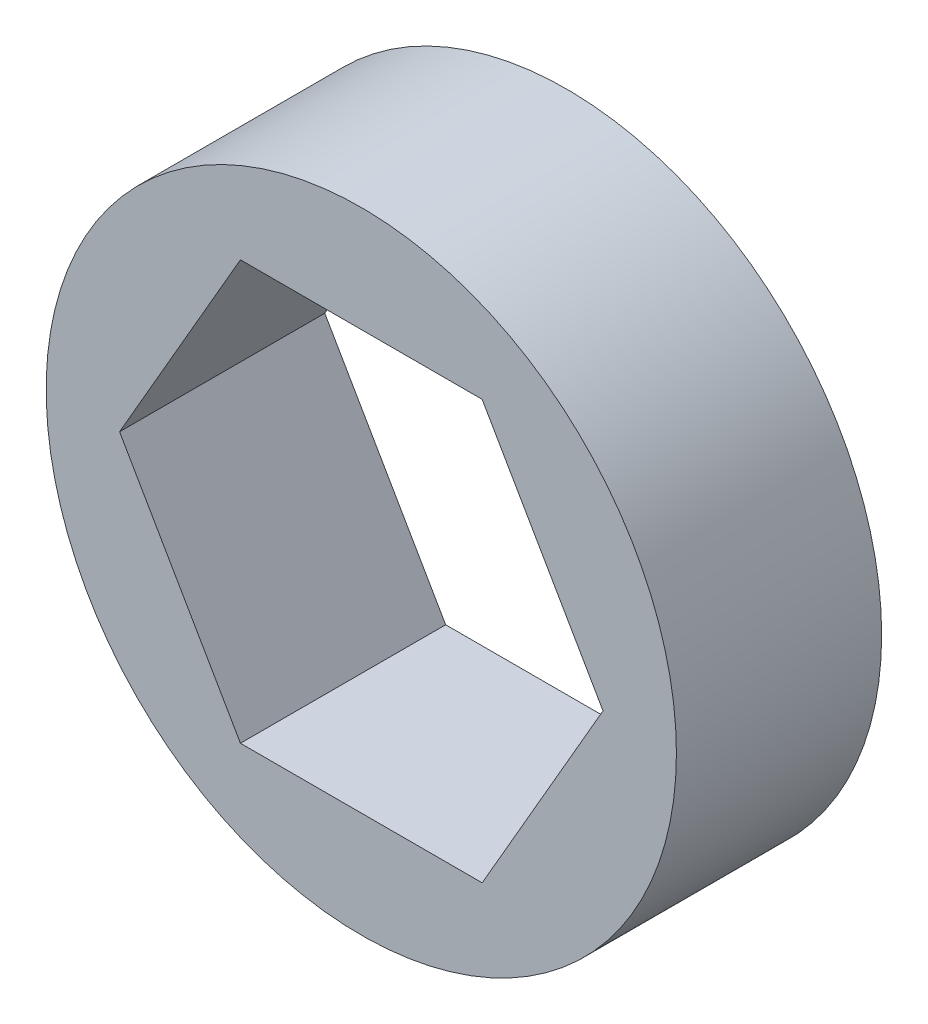
ISO-10303-21;
HEADER;
FILE_DESCRIPTION(('STEP AP214'),'2;1');
FILE_NAME('part.step','',(''),(''),'','','');
FILE_SCHEMA(('AUTOMOTIVE_DESIGN { 1 0 10303 214 1 1 1 1 }'));
ENDSEC;
DATA;
#1=APPLICATION_CONTEXT('core data for automotive mechanical design processes');
#2=APPLICATION_PROTOCOL_DEFINITION('international standard','automotive_design',2000,#1);
#3=PRODUCT_CONTEXT('',#1,'mechanical');
#4=PRODUCT('Part','Part','',(#3));
#5=PRODUCT_RELATED_PRODUCT_CATEGORY('part','',(#4));
#6=PRODUCT_DEFINITION_FORMATION('','',#4);
#7=PRODUCT_DEFINITION_CONTEXT('part definition',#1,'design');
#8=PRODUCT_DEFINITION('design','',#6,#7);
#9=PRODUCT_DEFINITION_SHAPE('','',#8);
#10=(LENGTH_UNIT() NAMED_UNIT(*) SI_UNIT(.MILLI.,.METRE.));
#11=(NAMED_UNIT(*) PLANE_ANGLE_UNIT() SI_UNIT($,.RADIAN.));
#12=(NAMED_UNIT(*) SI_UNIT($,.STERADIAN.) SOLID_ANGLE_UNIT());
#13=UNCERTAINTY_MEASURE_WITH_UNIT(LENGTH_MEASURE(1.E-05),#10,'distance_accuracy_value','');
#14=(GEOMETRIC_REPRESENTATION_CONTEXT(3) GLOBAL_UNCERTAINTY_ASSIGNED_CONTEXT((#13)) GLOBAL_UNIT_ASSIGNED_CONTEXT((#10,
#11,#12)) REPRESENTATION_CONTEXT('',''));
#15=CARTESIAN_POINT('',(0.,0.,0.));
#16=DIRECTION('',(0.,0.,1.));
#17=DIRECTION('',(1.,0.,0.));
#18=AXIS2_PLACEMENT_3D('',#15,#16,#17);
#19=CARTESIAN_POINT('',(0.,0.,-3.175));
#20=DIRECTION('',(0.,0.,1.));
#21=DIRECTION('',(1.,0.,0.));
#22=AXIS2_PLACEMENT_3D('',#19,#20,#21);
#23=CYLINDRICAL_SURFACE('',#22,9.75);
#24=CARTESIAN_POINT('',(0.,0.,-3.175));
#25=DIRECTION('',(0.,0.,1.));
#26=DIRECTION('',(-1.,0.,0.));
#27=AXIS2_PLACEMENT_3D('',#24,#25,#26);
#28=CIRCLE('',#27,9.75);
#29=CARTESIAN_POINT('',(9.75,0.,-3.175));
#30=VERTEX_POINT('',#29);
#31=EDGE_CURVE('E11',#30,#30,#28,.T.);
#32=CARTESIAN_POINT('',(0.,0.,3.175));
#33=DIRECTION('',(0.,0.,1.));
#34=DIRECTION('',(-1.,0.,0.));
#35=AXIS2_PLACEMENT_3D('',#32,#33,#34);
#36=CIRCLE('',#35,9.75);
#37=CARTESIAN_POINT('',(9.75,0.,3.175));
#38=VERTEX_POINT('',#37);
#39=EDGE_CURVE('E37',#38,#38,#36,.T.);
#40=CARTESIAN_POINT('',(9.75,0.,-3.175));
#41=CARTESIAN_POINT('',(9.75,0.,-3.10885416666667));
#42=CARTESIAN_POINT('',(9.75,0.,-3.04270833333333));
#43=CARTESIAN_POINT('',(9.75,0.,-2.91041666666667));
#44=CARTESIAN_POINT('',(9.75,0.,-2.84427083333333));
#45=CARTESIAN_POINT('',(9.75,0.,-2.71197916666667));
#46=CARTESIAN_POINT('',(9.75,0.,-2.64583333333333));
#47=CARTESIAN_POINT('',(9.75,0.,-2.51354166666667));
#48=CARTESIAN_POINT('',(9.75,0.,-2.44739583333333));
#49=CARTESIAN_POINT('',(9.75,0.,-2.31510416666667));
#50=CARTESIAN_POINT('',(9.75,0.,-2.24895833333333));
#51=CARTESIAN_POINT('',(9.75,0.,-2.11666666666667));
#52=CARTESIAN_POINT('',(9.75,0.,-2.05052083333333));
#53=CARTESIAN_POINT('',(9.75,0.,-1.91822916666667));
#54=CARTESIAN_POINT('',(9.75,0.,-1.85208333333333));
#55=CARTESIAN_POINT('',(9.75,0.,-1.71979166666667));
#56=CARTESIAN_POINT('',(9.75,0.,-1.65364583333333));
#57=CARTESIAN_POINT('',(9.75,0.,-1.52135416666667));
#58=CARTESIAN_POINT('',(9.75,0.,-1.45520833333333));
#59=CARTESIAN_POINT('',(9.75,0.,-1.32291666666667));
#60=CARTESIAN_POINT('',(9.75,0.,-1.25677083333333));
#61=CARTESIAN_POINT('',(9.75,0.,-1.12447916666667));
#62=CARTESIAN_POINT('',(9.75,0.,-1.05833333333333));
#63=CARTESIAN_POINT('',(9.75,0.,-0.926041666666667));
#64=CARTESIAN_POINT('',(9.75,0.,-0.859895833333333));
#65=CARTESIAN_POINT('',(9.75,0.,-0.727604166666667));
#66=CARTESIAN_POINT('',(9.75,0.,-0.661458333333334));
#67=CARTESIAN_POINT('',(9.75,0.,-0.529166666666667));
#68=CARTESIAN_POINT('',(9.75,0.,-0.463020833333333));
#69=CARTESIAN_POINT('',(9.75,0.,-0.330729166666667));
#70=CARTESIAN_POINT('',(9.75,0.,-0.264583333333333));
#71=CARTESIAN_POINT('',(9.75,0.,-0.132291666666667));
#72=CARTESIAN_POINT('',(9.75,0.,-0.0661458333333333));
#73=CARTESIAN_POINT('',(9.75,0.,0.0661458333333333));
#74=CARTESIAN_POINT('',(9.75,0.,0.132291666666667));
#75=CARTESIAN_POINT('',(9.75,0.,0.264583333333333));
#76=CARTESIAN_POINT('',(9.75,0.,0.330729166666667));
#77=CARTESIAN_POINT('',(9.75,0.,0.463020833333333));
#78=CARTESIAN_POINT('',(9.75,0.,0.529166666666667));
#79=CARTESIAN_POINT('',(9.75,0.,0.661458333333334));
#80=CARTESIAN_POINT('',(9.75,0.,0.727604166666667));
#81=CARTESIAN_POINT('',(9.75,0.,0.859895833333333));
#82=CARTESIAN_POINT('',(9.75,0.,0.926041666666666));
#83=CARTESIAN_POINT('',(9.75,0.,1.05833333333333));
#84=CARTESIAN_POINT('',(9.75,0.,1.12447916666667));
#85=CARTESIAN_POINT('',(9.75,0.,1.25677083333333));
#86=CARTESIAN_POINT('',(9.75,0.,1.32291666666667));
#87=CARTESIAN_POINT('',(9.75,0.,1.45520833333333));
#88=CARTESIAN_POINT('',(9.75,0.,1.52135416666667));
#89=CARTESIAN_POINT('',(9.75,0.,1.65364583333333));
#90=CARTESIAN_POINT('',(9.75,0.,1.71979166666667));
#91=CARTESIAN_POINT('',(9.75,0.,1.85208333333333));
#92=CARTESIAN_POINT('',(9.75,0.,1.91822916666667));
#93=CARTESIAN_POINT('',(9.75,0.,2.05052083333333));
#94=CARTESIAN_POINT('',(9.75,0.,2.11666666666667));
#95=CARTESIAN_POINT('',(9.75,0.,2.24895833333333));
#96=CARTESIAN_POINT('',(9.75,0.,2.31510416666667));
#97=CARTESIAN_POINT('',(9.75,0.,2.44739583333333));
#98=CARTESIAN_POINT('',(9.75,0.,2.51354166666667));
#99=CARTESIAN_POINT('',(9.75,0.,2.64583333333333));
#100=CARTESIAN_POINT('',(9.75,0.,2.71197916666667));
#101=CARTESIAN_POINT('',(9.75,0.,2.84427083333333));
#102=CARTESIAN_POINT('',(9.75,0.,2.91041666666667));
#103=CARTESIAN_POINT('',(9.75,0.,3.04270833333333));
#104=CARTESIAN_POINT('',(9.75,0.,3.10885416666667));
#105=CARTESIAN_POINT('',(9.75,0.,3.175));
#106=B_SPLINE_CURVE_WITH_KNOTS('',3,(#40,#41,#42,#43,#44,#45,#46,#47,#48,#49,#50,#51,#52,#53,
#54,#55,#56,#57,#58,#59,#60,#61,#62,#63,#64,#65,#66,#67,#68,#69,#70,#71,#72,#73,#74,#75,#76,#77,
#78,#79,#80,#81,#82,#83,#84,#85,#86,#87,#88,#89,#90,#91,#92,#93,#94,#95,#96,#97,#98,#99,#100,
#101,#102,#103,#104,#105),.UNSPECIFIED.,.F.,.F.,(4,2,2,2,2,2,2,2,2,2,2,2,2,2,2,2,2,2,2,2,2,2,2,
2,2,2,2,2,2,2,2,2,4),(0.,0.1984375,0.396875,0.5953125,0.79375,0.9921875,1.190625,1.3890625,
1.5875,1.7859375,1.984375,2.1828125,2.38125,2.5796875,2.778125,2.9765625,3.175,3.3734375,
3.571875,3.7703125,3.96875,4.1671875,4.365625,4.5640625,4.7625,4.9609375,5.159375,5.3578125,
5.55625,5.7546875,5.953125,6.1515625,6.35),.UNSPECIFIED.);
#107=EDGE_CURVE('BSEAM34',#30,#38,#106,.T.);
#108=ORIENTED_EDGE('',*,*,#31,.T.);
#109=ORIENTED_EDGE('',*,*,#39,.F.);
#110=ORIENTED_EDGE('',*,*,#107,.T.);
#111=ORIENTED_EDGE('',*,*,#107,.F.);
#112=EDGE_LOOP('',(#108,#110,#109,#111));
#113=FACE_BOUND('',#112,.T.);
#114=ADVANCED_FACE('F34',(#113),#23,.T.);
#115=CARTESIAN_POINT('',(0.,0.,-3.175));
#116=DIRECTION('',(0.,0.,-1.));
#117=DIRECTION('',(-1.,0.,0.));
#118=AXIS2_PLACEMENT_3D('',#115,#116,#117);
#119=PLANE('',#118);
#120=DIRECTION('',(-0.5,-0.866025403784439,0.));
#121=VECTOR('',#120,1.);
#122=CARTESIAN_POINT('',(-7.47899538708241,0.,-3.175));
#123=LINE('',#122,#121);
#124=CARTESIAN_POINT('',(-3.73949769354121,6.477,-3.175));
#125=VERTEX_POINT('',#124);
#126=CARTESIAN_POINT('',(-7.47899538708241,0.,-3.175));
#127=VERTEX_POINT('',#126);
#128=EDGE_CURVE('E88',#125,#127,#123,.T.);
#129=ORIENTED_EDGE('',*,*,#128,.T.);
#130=DIRECTION('',(0.5,-0.866025403784439,0.));
#131=VECTOR('',#130,1.);
#132=CARTESIAN_POINT('',(-3.73949769354121,-6.477,-3.175));
#133=LINE('',#132,#131);
#134=CARTESIAN_POINT('',(-3.73949769354121,-6.477,-3.175));
#135=VERTEX_POINT('',#134);
#136=EDGE_CURVE('E97',#127,#135,#133,.T.);
#137=ORIENTED_EDGE('',*,*,#136,.T.);
#138=DIRECTION('',(1.,0.,0.));
#139=VECTOR('',#138,1.);
#140=CARTESIAN_POINT('',(3.73949769354121,-6.477,-3.175));
#141=LINE('',#140,#139);
#142=CARTESIAN_POINT('',(3.73949769354121,-6.477,-3.175));
#143=VERTEX_POINT('',#142);
#144=EDGE_CURVE('E48',#135,#143,#141,.T.);
#145=ORIENTED_EDGE('',*,*,#144,.T.);
#146=DIRECTION('',(0.5,0.866025403784439,0.));
#147=VECTOR('',#146,1.);
#148=CARTESIAN_POINT('',(7.47899538708242,0.,-3.175));
#149=LINE('',#148,#147);
#150=CARTESIAN_POINT('',(7.47899538708242,0.,-3.175));
#151=VERTEX_POINT('',#150);
#152=EDGE_CURVE('E112',#143,#151,#149,.T.);
#153=ORIENTED_EDGE('',*,*,#152,.T.);
#154=DIRECTION('',(-0.5,0.866025403784438,0.));
#155=VECTOR('',#154,1.);
#156=CARTESIAN_POINT('',(3.7394976935412,6.477,-3.175));
#157=LINE('',#156,#155);
#158=CARTESIAN_POINT('',(3.7394976935412,6.477,-3.175));
#159=VERTEX_POINT('',#158);
#160=EDGE_CURVE('E115',#151,#159,#157,.T.);
#161=ORIENTED_EDGE('',*,*,#160,.T.);
#162=DIRECTION('',(-1.,0.,0.));
#163=VECTOR('',#162,1.);
#164=CARTESIAN_POINT('',(-3.73949769354121,6.477,-3.175));
#165=LINE('',#164,#163);
#166=EDGE_CURVE('E94',#159,#125,#165,.T.);
#167=ORIENTED_EDGE('',*,*,#166,.T.);
#168=EDGE_LOOP('',(#129,#137,#145,#153,#161,#167));
#169=FACE_BOUND('',#168,.T.);
#170=ORIENTED_EDGE('',*,*,#31,.F.);
#171=EDGE_LOOP('',(#170));
#172=FACE_BOUND('',#171,.T.);
#173=ADVANCED_FACE('F101',(#169,#172),#119,.T.);
#174=CARTESIAN_POINT('',(0.,0.,3.175));
#175=DIRECTION('',(0.,0.,-1.));
#176=DIRECTION('',(-1.,0.,0.));
#177=AXIS2_PLACEMENT_3D('',#174,#175,#176);
#178=PLANE('',#177);
#179=DIRECTION('',(0.5,-0.866025403784439,0.));
#180=VECTOR('',#179,1.);
#181=CARTESIAN_POINT('',(-3.73949769354121,-6.477,3.175));
#182=LINE('',#181,#180);
#183=CARTESIAN_POINT('',(-7.47899538708242,0.,3.175));
#184=VERTEX_POINT('',#183);
#185=CARTESIAN_POINT('',(-3.73949769354121,-6.477,3.175));
#186=VERTEX_POINT('',#185);
#187=EDGE_CURVE('E119',#184,#186,#182,.T.);
#188=ORIENTED_EDGE('',*,*,#187,.F.);
#189=DIRECTION('',(-0.5,-0.866025403784439,0.));
#190=VECTOR('',#189,1.);
#191=CARTESIAN_POINT('',(-7.47899538708241,0.,3.175));
#192=LINE('',#191,#190);
#193=CARTESIAN_POINT('',(-3.73949769354121,6.477,3.175));
#194=VERTEX_POINT('',#193);
#195=EDGE_CURVE('E56',#194,#184,#192,.T.);
#196=ORIENTED_EDGE('',*,*,#195,.F.);
#197=DIRECTION('',(-1.,0.,0.));
#198=VECTOR('',#197,1.);
#199=CARTESIAN_POINT('',(-3.73949769354121,6.477,3.175));
#200=LINE('',#199,#198);
#201=CARTESIAN_POINT('',(3.7394976935412,6.477,3.175));
#202=VERTEX_POINT('',#201);
#203=EDGE_CURVE('E105',#202,#194,#200,.T.);
#204=ORIENTED_EDGE('',*,*,#203,.F.);
#205=DIRECTION('',(-0.5,0.866025403784438,0.));
#206=VECTOR('',#205,1.);
#207=CARTESIAN_POINT('',(3.7394976935412,6.477,3.175));
#208=LINE('',#207,#206);
#209=CARTESIAN_POINT('',(7.47899538708242,0.,3.175));
#210=VERTEX_POINT('',#209);
#211=EDGE_CURVE('E108',#210,#202,#208,.T.);
#212=ORIENTED_EDGE('',*,*,#211,.F.);
#213=DIRECTION('',(0.5,0.866025403784439,0.));
#214=VECTOR('',#213,1.);
#215=CARTESIAN_POINT('',(7.47899538708242,0.,3.175));
#216=LINE('',#215,#214);
#217=CARTESIAN_POINT('',(3.73949769354121,-6.477,3.175));
#218=VERTEX_POINT('',#217);
#219=EDGE_CURVE('E124',#218,#210,#216,.T.);
#220=ORIENTED_EDGE('',*,*,#219,.F.);
#221=DIRECTION('',(1.,0.,0.));
#222=VECTOR('',#221,1.);
#223=CARTESIAN_POINT('',(3.73949769354121,-6.477,3.175));
#224=LINE('',#223,#222);
#225=EDGE_CURVE('E121',#186,#218,#224,.T.);
#226=ORIENTED_EDGE('',*,*,#225,.F.);
#227=EDGE_LOOP('',(#188,#196,#204,#212,#220,#226));
#228=FACE_BOUND('',#227,.T.);
#229=ORIENTED_EDGE('',*,*,#39,.T.);
#230=EDGE_LOOP('',(#229));
#231=FACE_BOUND('',#230,.T.);
#232=ADVANCED_FACE('F141',(#228,#231),#178,.F.);
#233=CARTESIAN_POINT('',(-7.47899538708241,0.,-3.175));
#234=DIRECTION('',(-0.866025403784439,0.5,0.));
#235=DIRECTION('',(-0.5,-0.866025403784439,0.));
#236=AXIS2_PLACEMENT_3D('',#233,#234,#235);
#237=PLANE('',#236);
#238=ORIENTED_EDGE('',*,*,#195,.T.);
#239=DIRECTION('',(0.,0.,1.));
#240=VECTOR('',#239,1.);
#241=CARTESIAN_POINT('',(-7.47899538708241,0.,-3.175));
#242=LINE('',#241,#240);
#243=EDGE_CURVE('E84',#127,#184,#242,.T.);
#244=ORIENTED_EDGE('',*,*,#243,.F.);
#245=ORIENTED_EDGE('',*,*,#128,.F.);
#246=DIRECTION('',(0.,0.,1.));
#247=VECTOR('',#246,1.);
#248=CARTESIAN_POINT('',(-3.73949769354121,6.477,-3.175));
#249=LINE('',#248,#247);
#250=EDGE_CURVE('E129',#125,#194,#249,.T.);
#251=ORIENTED_EDGE('',*,*,#250,.T.);
#252=EDGE_LOOP('',(#238,#244,#245,#251));
#253=FACE_BOUND('',#252,.T.);
#254=ADVANCED_FACE('F86',(#253),#237,.F.);
#255=CARTESIAN_POINT('',(-3.73949769354121,6.477,-3.175));
#256=DIRECTION('',(0.,1.,0.));
#257=DIRECTION('',(-1.,0.,0.));
#258=AXIS2_PLACEMENT_3D('',#255,#256,#257);
#259=PLANE('',#258);
#260=ORIENTED_EDGE('',*,*,#203,.T.);
#261=ORIENTED_EDGE('',*,*,#250,.F.);
#262=ORIENTED_EDGE('',*,*,#166,.F.);
#263=DIRECTION('',(0.,0.,1.));
#264=VECTOR('',#263,1.);
#265=CARTESIAN_POINT('',(3.7394976935412,6.477,-3.175));
#266=LINE('',#265,#264);
#267=EDGE_CURVE('E131',#159,#202,#266,.T.);
#268=ORIENTED_EDGE('',*,*,#267,.T.);
#269=EDGE_LOOP('',(#260,#261,#262,#268));
#270=FACE_BOUND('',#269,.T.);
#271=ADVANCED_FACE('F152',(#270),#259,.F.);
#272=CARTESIAN_POINT('',(3.7394976935412,6.477,-3.175));
#273=DIRECTION('',(0.866025403784438,0.5,0.));
#274=DIRECTION('',(-0.5,0.866025403784439,0.));
#275=AXIS2_PLACEMENT_3D('',#272,#273,#274);
#276=PLANE('',#275);
#277=ORIENTED_EDGE('',*,*,#211,.T.);
#278=ORIENTED_EDGE('',*,*,#267,.F.);
#279=ORIENTED_EDGE('',*,*,#160,.F.);
#280=DIRECTION('',(0.,0.,1.));
#281=VECTOR('',#280,1.);
#282=CARTESIAN_POINT('',(7.47899538708242,0.,-3.175));
#283=LINE('',#282,#281);
#284=EDGE_CURVE('E133',#151,#210,#283,.T.);
#285=ORIENTED_EDGE('',*,*,#284,.T.);
#286=EDGE_LOOP('',(#277,#278,#279,#285));
#287=FACE_BOUND('',#286,.T.);
#288=ADVANCED_FACE('F150',(#287),#276,.F.);
#289=CARTESIAN_POINT('',(7.47899538708242,0.,-3.175));
#290=DIRECTION('',(0.866025403784439,-0.5,0.));
#291=DIRECTION('',(0.5,0.866025403784439,0.));
#292=AXIS2_PLACEMENT_3D('',#289,#290,#291);
#293=PLANE('',#292);
#294=ORIENTED_EDGE('',*,*,#219,.T.);
#295=ORIENTED_EDGE('',*,*,#284,.F.);
#296=ORIENTED_EDGE('',*,*,#152,.F.);
#297=DIRECTION('',(0.,0.,1.));
#298=VECTOR('',#297,1.);
#299=CARTESIAN_POINT('',(3.73949769354121,-6.477,-3.175));
#300=LINE('',#299,#298);
#301=EDGE_CURVE('E135',#143,#218,#300,.T.);
#302=ORIENTED_EDGE('',*,*,#301,.T.);
#303=EDGE_LOOP('',(#294,#295,#296,#302));
#304=FACE_BOUND('',#303,.T.);
#305=ADVANCED_FACE('F146',(#304),#293,.F.);
#306=CARTESIAN_POINT('',(3.73949769354121,-6.477,-3.175));
#307=DIRECTION('',(0.,-1.,0.));
#308=DIRECTION('',(0.,0.,-1.));
#309=AXIS2_PLACEMENT_3D('',#306,#307,#308);
#310=PLANE('',#309);
#311=ORIENTED_EDGE('',*,*,#225,.T.);
#312=ORIENTED_EDGE('',*,*,#301,.F.);
#313=ORIENTED_EDGE('',*,*,#144,.F.);
#314=DIRECTION('',(0.,0.,1.));
#315=VECTOR('',#314,1.);
#316=CARTESIAN_POINT('',(-3.73949769354121,-6.477,-3.175));
#317=LINE('',#316,#315);
#318=EDGE_CURVE('E93',#135,#186,#317,.T.);
#319=ORIENTED_EDGE('',*,*,#318,.T.);
#320=EDGE_LOOP('',(#311,#312,#313,#319));
#321=FACE_BOUND('',#320,.T.);
#322=ADVANCED_FACE('F137',(#321),#310,.F.);
#323=CARTESIAN_POINT('',(-3.73949769354121,-6.477,-3.175));
#324=DIRECTION('',(-0.866025403784439,-0.5,0.));
#325=DIRECTION('',(0.5,-0.866025403784438,0.));
#326=AXIS2_PLACEMENT_3D('',#323,#324,#325);
#327=PLANE('',#326);
#328=ORIENTED_EDGE('',*,*,#187,.T.);
#329=ORIENTED_EDGE('',*,*,#318,.F.);
#330=ORIENTED_EDGE('',*,*,#136,.F.);
#331=ORIENTED_EDGE('',*,*,#243,.T.);
#332=EDGE_LOOP('',(#328,#329,#330,#331));
#333=FACE_BOUND('',#332,.T.);
#334=ADVANCED_FACE('F98',(#333),#327,.F.);
#335=CLOSED_SHELL('',(#114,#173,#232,#254,#271,#288,#305,#322,#334));
#336=MANIFOLD_SOLID_BREP('B2',#335);
#337=ADVANCED_BREP_SHAPE_REPRESENTATION('',(#18,#336),#14);
#338=SHAPE_DEFINITION_REPRESENTATION(#9,#337);
ENDSEC;
END-ISO-10303-21;
